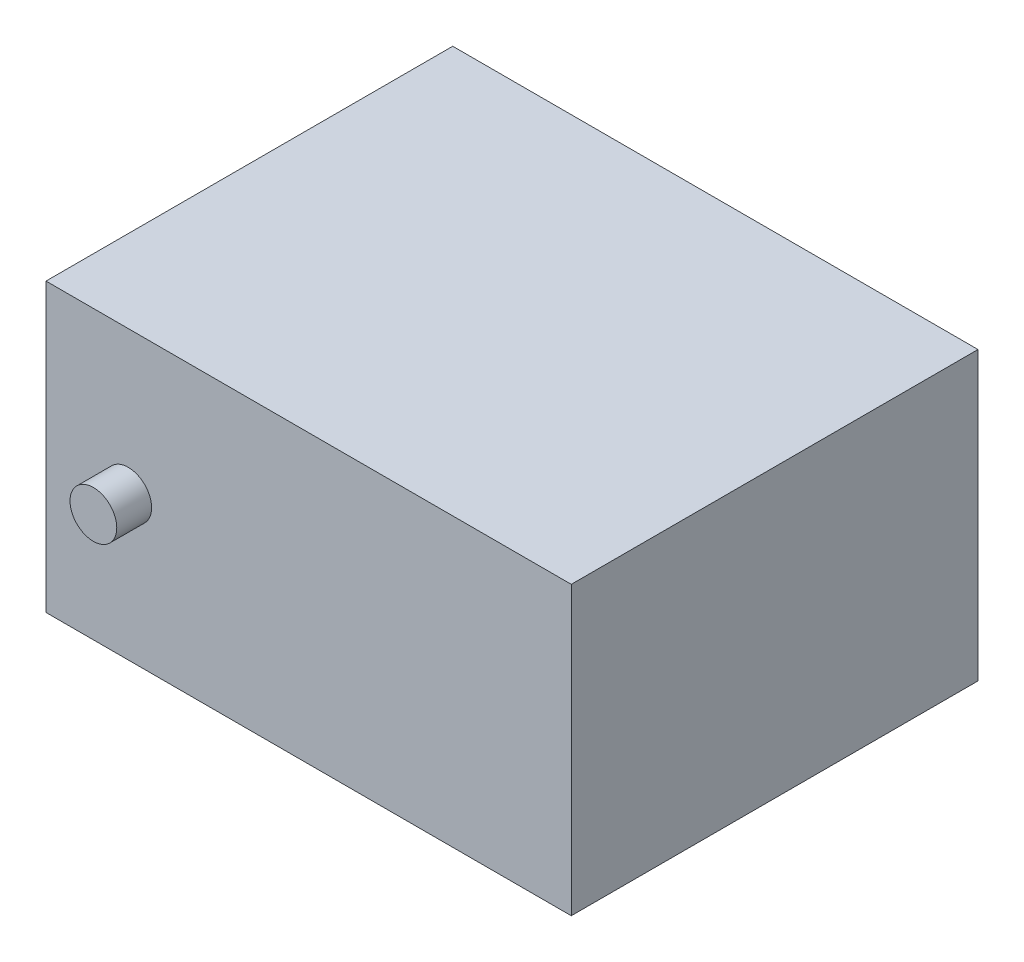
ISO-10303-21;
HEADER;
FILE_DESCRIPTION(('STEP AP214'),'2;1');
FILE_NAME('part.step','',(''),(''),'','','');
FILE_SCHEMA(('AUTOMOTIVE_DESIGN { 1 0 10303 214 1 1 1 1 }'));
ENDSEC;
DATA;
#1=APPLICATION_CONTEXT('core data for automotive mechanical design processes');
#2=APPLICATION_PROTOCOL_DEFINITION('international standard','automotive_design',2000,#1);
#3=PRODUCT_CONTEXT('',#1,'mechanical');
#4=PRODUCT('Part','Part','',(#3));
#5=PRODUCT_RELATED_PRODUCT_CATEGORY('part','',(#4));
#6=PRODUCT_DEFINITION_FORMATION('','',#4);
#7=PRODUCT_DEFINITION_CONTEXT('part definition',#1,'design');
#8=PRODUCT_DEFINITION('design','',#6,#7);
#9=PRODUCT_DEFINITION_SHAPE('','',#8);
#10=(LENGTH_UNIT() NAMED_UNIT(*) SI_UNIT(.MILLI.,.METRE.));
#11=(NAMED_UNIT(*) PLANE_ANGLE_UNIT() SI_UNIT($,.RADIAN.));
#12=(NAMED_UNIT(*) SI_UNIT($,.STERADIAN.) SOLID_ANGLE_UNIT());
#13=UNCERTAINTY_MEASURE_WITH_UNIT(LENGTH_MEASURE(1.E-05),#10,'distance_accuracy_value','');
#14=(GEOMETRIC_REPRESENTATION_CONTEXT(3) GLOBAL_UNCERTAINTY_ASSIGNED_CONTEXT((#13)) GLOBAL_UNIT_ASSIGNED_CONTEXT((#10,
#11,#12)) REPRESENTATION_CONTEXT('',''));
#15=CARTESIAN_POINT('',(0.,0.,0.));
#16=DIRECTION('',(0.,0.,1.));
#17=DIRECTION('',(1.,0.,0.));
#18=AXIS2_PLACEMENT_3D('',#15,#16,#17);
#19=CARTESIAN_POINT('',(22.6,-12.35,35.));
#20=DIRECTION('',(-1.,0.,0.));
#21=DIRECTION('',(0.,0.,1.));
#22=AXIS2_PLACEMENT_3D('',#19,#20,#21);
#23=PLANE('',#22);
#24=DIRECTION('',(0.,1.,0.));
#25=VECTOR('',#24,1.);
#26=CARTESIAN_POINT('',(22.6,-12.35,0.));
#27=LINE('',#26,#25);
#28=CARTESIAN_POINT('',(22.6,-12.35,0.));
#29=VERTEX_POINT('',#28);
#30=CARTESIAN_POINT('',(22.6,12.35,0.));
#31=VERTEX_POINT('',#30);
#32=EDGE_CURVE('E116',#29,#31,#27,.T.);
#33=ORIENTED_EDGE('',*,*,#32,.T.);
#34=DIRECTION('',(0.,0.,-1.));
#35=VECTOR('',#34,1.);
#36=CARTESIAN_POINT('',(22.6,12.35,35.));
#37=LINE('',#36,#35);
#38=CARTESIAN_POINT('',(22.6,12.35,35.));
#39=VERTEX_POINT('',#38);
#40=EDGE_CURVE('E54',#39,#31,#37,.T.);
#41=ORIENTED_EDGE('',*,*,#40,.F.);
#42=DIRECTION('',(0.,1.,0.));
#43=VECTOR('',#42,1.);
#44=CARTESIAN_POINT('',(22.6,-12.35,35.));
#45=LINE('',#44,#43);
#46=CARTESIAN_POINT('',(22.6,-12.35,35.));
#47=VERTEX_POINT('',#46);
#48=EDGE_CURVE('E98',#47,#39,#45,.T.);
#49=ORIENTED_EDGE('',*,*,#48,.F.);
#50=DIRECTION('',(0.,0.,-1.));
#51=VECTOR('',#50,1.);
#52=CARTESIAN_POINT('',(22.6,-12.35,35.));
#53=LINE('',#52,#51);
#54=EDGE_CURVE('E112',#47,#29,#53,.T.);
#55=ORIENTED_EDGE('',*,*,#54,.T.);
#56=EDGE_LOOP('',(#33,#41,#49,#55));
#57=FACE_BOUND('',#56,.T.);
#58=ADVANCED_FACE('F45',(#57),#23,.F.);
#59=CARTESIAN_POINT('',(-22.6,12.35,35.));
#60=DIRECTION('',(0.,-1.,0.));
#61=DIRECTION('',(0.,0.,-1.));
#62=AXIS2_PLACEMENT_3D('',#59,#60,#61);
#63=PLANE('',#62);
#64=DIRECTION('',(-1.,0.,0.));
#65=VECTOR('',#64,1.);
#66=CARTESIAN_POINT('',(-22.6,12.35,0.));
#67=LINE('',#66,#65);
#68=CARTESIAN_POINT('',(-22.6,12.35,0.));
#69=VERTEX_POINT('',#68);
#70=EDGE_CURVE('E104',#31,#69,#67,.T.);
#71=ORIENTED_EDGE('',*,*,#70,.T.);
#72=DIRECTION('',(0.,0.,-1.));
#73=VECTOR('',#72,1.);
#74=CARTESIAN_POINT('',(-22.6,12.35,35.));
#75=LINE('',#74,#73);
#76=CARTESIAN_POINT('',(-22.6,12.35,35.));
#77=VERTEX_POINT('',#76);
#78=EDGE_CURVE('E102',#77,#69,#75,.T.);
#79=ORIENTED_EDGE('',*,*,#78,.F.);
#80=DIRECTION('',(-1.,0.,0.));
#81=VECTOR('',#80,1.);
#82=CARTESIAN_POINT('',(-22.6,12.35,35.));
#83=LINE('',#82,#81);
#84=EDGE_CURVE('E93',#39,#77,#83,.T.);
#85=ORIENTED_EDGE('',*,*,#84,.F.);
#86=ORIENTED_EDGE('',*,*,#40,.T.);
#87=EDGE_LOOP('',(#71,#79,#85,#86));
#88=FACE_BOUND('',#87,.T.);
#89=ADVANCED_FACE('F103',(#88),#63,.F.);
#90=CARTESIAN_POINT('',(-22.6,-12.35,35.));
#91=DIRECTION('',(1.,0.,0.));
#92=DIRECTION('',(0.,0.,-1.));
#93=AXIS2_PLACEMENT_3D('',#90,#91,#92);
#94=PLANE('',#93);
#95=DIRECTION('',(0.,-1.,0.));
#96=VECTOR('',#95,1.);
#97=CARTESIAN_POINT('',(-22.6,-12.35,0.));
#98=LINE('',#97,#96);
#99=CARTESIAN_POINT('',(-22.6,-12.35,0.));
#100=VERTEX_POINT('',#99);
#101=EDGE_CURVE('E79',#69,#100,#98,.T.);
#102=ORIENTED_EDGE('',*,*,#101,.T.);
#103=DIRECTION('',(0.,0.,-1.));
#104=VECTOR('',#103,1.);
#105=CARTESIAN_POINT('',(-22.6,-12.35,35.));
#106=LINE('',#105,#104);
#107=CARTESIAN_POINT('',(-22.6,-12.35,35.));
#108=VERTEX_POINT('',#107);
#109=EDGE_CURVE('E106',#108,#100,#106,.T.);
#110=ORIENTED_EDGE('',*,*,#109,.F.);
#111=DIRECTION('',(0.,-1.,0.));
#112=VECTOR('',#111,1.);
#113=CARTESIAN_POINT('',(-22.6,-12.35,35.));
#114=LINE('',#113,#112);
#115=EDGE_CURVE('E96',#77,#108,#114,.T.);
#116=ORIENTED_EDGE('',*,*,#115,.F.);
#117=ORIENTED_EDGE('',*,*,#78,.T.);
#118=EDGE_LOOP('',(#102,#110,#116,#117));
#119=FACE_BOUND('',#118,.T.);
#120=ADVANCED_FACE('F108',(#119),#94,.F.);
#121=CARTESIAN_POINT('',(-22.6,-12.35,35.));
#122=DIRECTION('',(0.,1.,0.));
#123=DIRECTION('',(0.,0.,1.));
#124=AXIS2_PLACEMENT_3D('',#121,#122,#123);
#125=PLANE('',#124);
#126=DIRECTION('',(1.,0.,0.));
#127=VECTOR('',#126,1.);
#128=CARTESIAN_POINT('',(-22.6,-12.35,0.));
#129=LINE('',#128,#127);
#130=EDGE_CURVE('E85',#100,#29,#129,.T.);
#131=ORIENTED_EDGE('',*,*,#130,.T.);
#132=ORIENTED_EDGE('',*,*,#54,.F.);
#133=DIRECTION('',(1.,0.,0.));
#134=VECTOR('',#133,1.);
#135=CARTESIAN_POINT('',(-22.6,-12.35,35.));
#136=LINE('',#135,#134);
#137=EDGE_CURVE('E62',#108,#47,#136,.T.);
#138=ORIENTED_EDGE('',*,*,#137,.F.);
#139=ORIENTED_EDGE('',*,*,#109,.T.);
#140=EDGE_LOOP('',(#131,#132,#138,#139));
#141=FACE_BOUND('',#140,.T.);
#142=ADVANCED_FACE('F146',(#141),#125,.F.);
#143=CARTESIAN_POINT('',(0.,0.,35.));
#144=DIRECTION('',(0.,0.,-1.));
#145=DIRECTION('',(-1.,0.,0.));
#146=AXIS2_PLACEMENT_3D('',#143,#144,#145);
#147=PLANE('',#146);
#148=CARTESIAN_POINT('',(-15.521537577036,0.,35.));
#149=DIRECTION('',(0.,0.,-1.));
#150=DIRECTION('',(-1.,0.,0.));
#151=AXIS2_PLACEMENT_3D('',#148,#149,#150);
#152=CIRCLE('',#151,2.01031962594154);
#153=CARTESIAN_POINT('',(-17.5318572029776,0.,35.));
#154=VERTEX_POINT('',#153);
#155=EDGE_CURVE('E11',#154,#154,#152,.F.);
#156=ORIENTED_EDGE('',*,*,#155,.F.);
#157=EDGE_LOOP('',(#156));
#158=FACE_BOUND('',#157,.T.);
#159=ORIENTED_EDGE('',*,*,#48,.T.);
#160=ORIENTED_EDGE('',*,*,#84,.T.);
#161=ORIENTED_EDGE('',*,*,#115,.T.);
#162=ORIENTED_EDGE('',*,*,#137,.T.);
#163=EDGE_LOOP('',(#159,#160,#161,#162));
#164=FACE_BOUND('',#163,.T.);
#165=ADVANCED_FACE('F94',(#158,#164),#147,.F.);
#166=CARTESIAN_POINT('',(0.,0.,0.));
#167=DIRECTION('',(0.,0.,-1.));
#168=DIRECTION('',(-1.,0.,0.));
#169=AXIS2_PLACEMENT_3D('',#166,#167,#168);
#170=PLANE('',#169);
#171=ORIENTED_EDGE('',*,*,#32,.F.);
#172=ORIENTED_EDGE('',*,*,#130,.F.);
#173=ORIENTED_EDGE('',*,*,#101,.F.);
#174=ORIENTED_EDGE('',*,*,#70,.F.);
#175=EDGE_LOOP('',(#171,#172,#173,#174));
#176=FACE_BOUND('',#175,.T.);
#177=ADVANCED_FACE('F134',(#176),#170,.T.);
#178=CARTESIAN_POINT('',(-15.521537577036,0.,38.));
#179=DIRECTION('',(0.,0.,-1.));
#180=DIRECTION('',(-1.,0.,0.));
#181=AXIS2_PLACEMENT_3D('',#178,#179,#180);
#182=CYLINDRICAL_SURFACE('',#181,2.01031962594154);
#183=CARTESIAN_POINT('',(-15.521537577036,0.,38.));
#184=DIRECTION('',(0.,0.,1.));
#185=DIRECTION('',(1.,0.,0.));
#186=AXIS2_PLACEMENT_3D('',#183,#184,#185);
#187=CIRCLE('',#186,2.01031962594154);
#188=CARTESIAN_POINT('',(-13.5112179510945,0.,38.));
#189=VERTEX_POINT('',#188);
#190=EDGE_CURVE('E120',#189,#189,#187,.T.);
#191=ORIENTED_EDGE('',*,*,#190,.F.);
#192=EDGE_LOOP('',(#191));
#193=FACE_BOUND('',#192,.T.);
#194=ORIENTED_EDGE('',*,*,#155,.T.);
#195=EDGE_LOOP('',(#194));
#196=FACE_BOUND('',#195,.T.);
#197=ADVANCED_FACE('F136',(#193,#196),#182,.T.);
#198=CARTESIAN_POINT('',(-15.521537577036,0.,38.));
#199=DIRECTION('',(0.,0.,1.));
#200=DIRECTION('',(1.,0.,0.));
#201=AXIS2_PLACEMENT_3D('',#198,#199,#200);
#202=PLANE('',#201);
#203=ORIENTED_EDGE('',*,*,#190,.T.);
#204=EDGE_LOOP('',(#203));
#205=FACE_BOUND('',#204,.T.);
#206=ADVANCED_FACE('F143',(#205),#202,.T.);
#207=CLOSED_SHELL('',(#58,#89,#120,#142,#165,#177,#197,#206));
#208=MANIFOLD_SOLID_BREP('B2',#207);
#209=ADVANCED_BREP_SHAPE_REPRESENTATION('',(#18,#208),#14);
#210=SHAPE_DEFINITION_REPRESENTATION(#9,#209);
ENDSEC;
END-ISO-10303-21;
